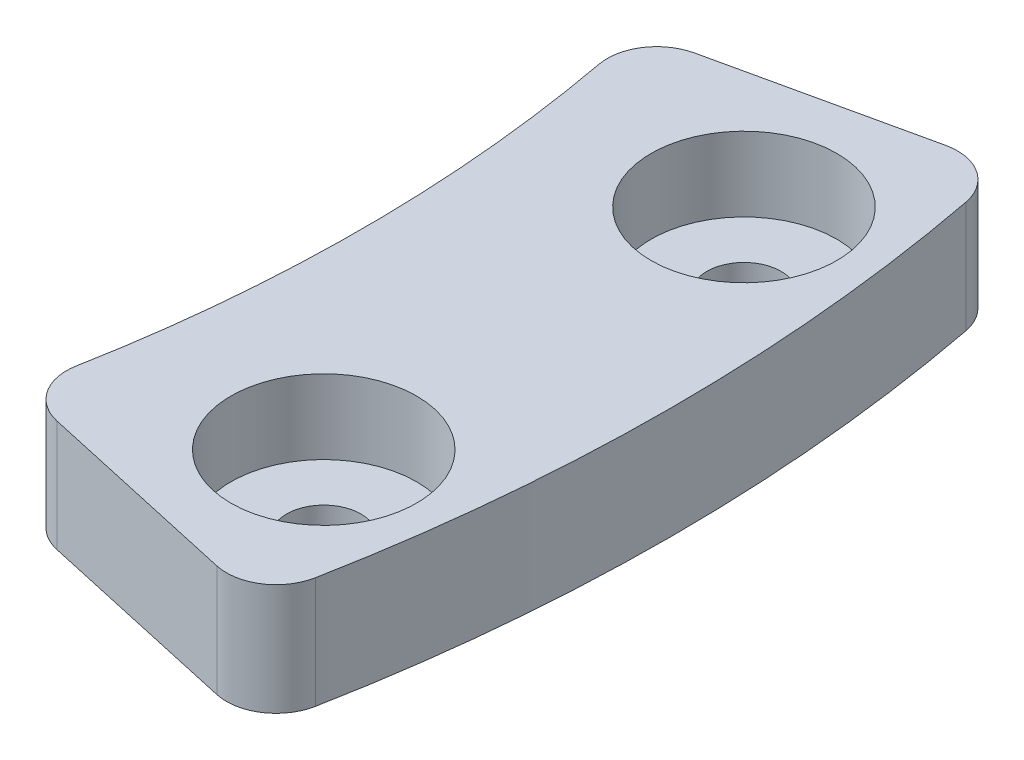
ISO-10303-21;
HEADER;
FILE_DESCRIPTION(('STEP AP214'),'2;1');
FILE_NAME('part.step','',(''),(''),'','','');
FILE_SCHEMA(('AUTOMOTIVE_DESIGN { 1 0 10303 214 1 1 1 1 }'));
ENDSEC;
DATA;
#1=APPLICATION_CONTEXT('core data for automotive mechanical design processes');
#2=APPLICATION_PROTOCOL_DEFINITION('international standard','automotive_design',2000,#1);
#3=PRODUCT_CONTEXT('',#1,'mechanical');
#4=PRODUCT('Part','Part','',(#3));
#5=PRODUCT_RELATED_PRODUCT_CATEGORY('part','',(#4));
#6=PRODUCT_DEFINITION_FORMATION('','',#4);
#7=PRODUCT_DEFINITION_CONTEXT('part definition',#1,'design');
#8=PRODUCT_DEFINITION('design','',#6,#7);
#9=PRODUCT_DEFINITION_SHAPE('','',#8);
#10=(LENGTH_UNIT() NAMED_UNIT(*) SI_UNIT(.MILLI.,.METRE.));
#11=(NAMED_UNIT(*) PLANE_ANGLE_UNIT() SI_UNIT($,.RADIAN.));
#12=(NAMED_UNIT(*) SI_UNIT($,.STERADIAN.) SOLID_ANGLE_UNIT());
#13=UNCERTAINTY_MEASURE_WITH_UNIT(LENGTH_MEASURE(1.E-05),#10,'distance_accuracy_value','');
#14=(GEOMETRIC_REPRESENTATION_CONTEXT(3) GLOBAL_UNCERTAINTY_ASSIGNED_CONTEXT((#13)) GLOBAL_UNIT_ASSIGNED_CONTEXT((#10,
#11,#12)) REPRESENTATION_CONTEXT('',''));
#15=CARTESIAN_POINT('',(0.,0.,0.));
#16=DIRECTION('',(0.,0.,1.));
#17=DIRECTION('',(1.,0.,0.));
#18=AXIS2_PLACEMENT_3D('',#15,#16,#17);
#19=CARTESIAN_POINT('',(64.4439159892977,4.5,-8.48420249430342));
#20=DIRECTION('',(0.,-1.,0.));
#21=DIRECTION('',(0.,0.,-1.));
#22=AXIS2_PLACEMENT_3D('',#19,#20,#21);
#23=CYLINDRICAL_SURFACE('',#22,1.5);
#24=CARTESIAN_POINT('',(64.4439159892977,0.,-8.48420249430342));
#25=DIRECTION('',(0.,1.,0.));
#26=DIRECTION('',(0.,0.,1.));
#27=AXIS2_PLACEMENT_3D('',#24,#25,#26);
#28=CIRCLE('',#27,1.5);
#29=CARTESIAN_POINT('',(64.4439159892977,0.,-6.98420249430342));
#30=VERTEX_POINT('',#29);
#31=EDGE_CURVE('E132',#30,#30,#28,.T.);
#32=ORIENTED_EDGE('',*,*,#31,.F.);
#33=EDGE_LOOP('',(#32));
#34=FACE_BOUND('',#33,.T.);
#35=CARTESIAN_POINT('',(64.4439159892977,1.5,-8.48420249430342));
#36=DIRECTION('',(0.,1.,0.));
#37=DIRECTION('',(0.,0.,1.));
#38=AXIS2_PLACEMENT_3D('',#35,#36,#37);
#39=CIRCLE('',#38,1.5);
#40=CARTESIAN_POINT('',(64.4439159892977,1.5,-6.98420249430342));
#41=VERTEX_POINT('',#40);
#42=EDGE_CURVE('E38',#41,#41,#39,.T.);
#43=ORIENTED_EDGE('',*,*,#42,.T.);
#44=EDGE_LOOP('',(#43));
#45=FACE_BOUND('',#44,.T.);
#46=ADVANCED_FACE('F34',(#34,#45),#23,.F.);
#47=CARTESIAN_POINT('',(64.4439159892977,4.5,8.48420249430342));
#48=DIRECTION('',(0.,-1.,0.));
#49=DIRECTION('',(0.,0.,-1.));
#50=AXIS2_PLACEMENT_3D('',#47,#48,#49);
#51=CYLINDRICAL_SURFACE('',#50,1.5);
#52=CARTESIAN_POINT('',(64.4439159892977,0.,8.48420249430342));
#53=DIRECTION('',(0.,1.,0.));
#54=DIRECTION('',(0.,0.,-1.));
#55=AXIS2_PLACEMENT_3D('',#52,#53,#54);
#56=CIRCLE('',#55,1.5);
#57=CARTESIAN_POINT('',(64.4439159892977,0.,6.98420249430342));
#58=VERTEX_POINT('',#57);
#59=EDGE_CURVE('E138',#58,#58,#56,.T.);
#60=ORIENTED_EDGE('',*,*,#59,.F.);
#61=EDGE_LOOP('',(#60));
#62=FACE_BOUND('',#61,.T.);
#63=CARTESIAN_POINT('',(64.4439159892977,1.5,8.48420249430342));
#64=DIRECTION('',(0.,1.,0.));
#65=DIRECTION('',(0.,0.,1.));
#66=AXIS2_PLACEMENT_3D('',#63,#64,#65);
#67=CIRCLE('',#66,1.5);
#68=CARTESIAN_POINT('',(64.4439159892977,1.5,9.98420249430342));
#69=VERTEX_POINT('',#68);
#70=EDGE_CURVE('E165',#69,#69,#67,.T.);
#71=ORIENTED_EDGE('',*,*,#70,.T.);
#72=EDGE_LOOP('',(#71));
#73=FACE_BOUND('',#72,.T.);
#74=ADVANCED_FACE('F219',(#62,#73),#51,.F.);
#75=CARTESIAN_POINT('',(0.,4.5,0.));
#76=DIRECTION('',(0.,1.,0.));
#77=DIRECTION('',(0.,0.,1.));
#78=AXIS2_PLACEMENT_3D('',#75,#76,#77);
#79=PLANE('',#78);
#80=CARTESIAN_POINT('',(64.4439159892977,4.5,-8.48420249430342));
#81=DIRECTION('',(0.,1.,0.));
#82=DIRECTION('',(0.,0.,1.));
#83=AXIS2_PLACEMENT_3D('',#80,#81,#82);
#84=CIRCLE('',#83,3.75000000000001);
#85=CARTESIAN_POINT('',(64.4439159892977,4.5,-4.73420249430341));
#86=VERTEX_POINT('',#85);
#87=EDGE_CURVE('E172',#86,#86,#84,.T.);
#88=ORIENTED_EDGE('',*,*,#87,.F.);
#89=EDGE_LOOP('',(#88));
#90=FACE_BOUND('',#89,.T.);
#91=CARTESIAN_POINT('',(64.4439159892977,4.5,8.48420249430342));
#92=DIRECTION('',(0.,1.,0.));
#93=DIRECTION('',(0.,0.,1.));
#94=AXIS2_PLACEMENT_3D('',#91,#92,#93);
#95=CIRCLE('',#94,3.75000000000001);
#96=CARTESIAN_POINT('',(64.4439159892977,4.5,12.2342024943034));
#97=VERTEX_POINT('',#96);
#98=EDGE_CURVE('E182',#97,#97,#95,.T.);
#99=ORIENTED_EDGE('',*,*,#98,.F.);
#100=EDGE_LOOP('',(#99));
#101=FACE_BOUND('',#100,.T.);
#102=DIRECTION('',(0.976296007119933,0.,0.216439613938103));
#103=VECTOR('',#102,1.);
#104=CARTESIAN_POINT('',(56.1370204093962,4.5,12.445277801441));
#105=LINE('',#104,#103);
#106=CARTESIAN_POINT('',(58.0567864762956,4.5,12.8708796919956));
#107=VERTEX_POINT('',#106);
#108=CARTESIAN_POINT('',(66.359407683121,4.5,14.7115264994949));
#109=VERTEX_POINT('',#108);
#110=EDGE_CURVE('E141',#107,#109,#105,.T.);
#111=ORIENTED_EDGE('',*,*,#110,.T.);
#112=CARTESIAN_POINT('',(66.7922869109972,4.5,12.758934485255));
#113=DIRECTION('',(0.,1.,0.));
#114=DIRECTION('',(0.,0.,1.));
#115=AXIS2_PLACEMENT_3D('',#112,#113,#114);
#116=CIRCLE('',#115,2.);
#117=CARTESIAN_POINT('',(68.7567659377913,4.5,13.1341972642331));
#118=VERTEX_POINT('',#117);
#119=EDGE_CURVE('E159',#109,#118,#116,.T.);
#120=ORIENTED_EDGE('',*,*,#119,.T.);
#121=CARTESIAN_POINT('',(0.,4.5,0.));
#122=DIRECTION('',(0.,1.,0.));
#123=DIRECTION('',(0.,0.,1.));
#124=AXIS2_PLACEMENT_3D('',#121,#122,#123);
#125=CIRCLE('',#124,70.);
#126=CARTESIAN_POINT('',(68.7567659377913,4.5,-13.1341972642331));
#127=VERTEX_POINT('',#126);
#128=EDGE_CURVE('E123',#118,#127,#125,.T.);
#129=ORIENTED_EDGE('',*,*,#128,.T.);
#130=CARTESIAN_POINT('',(66.7922869109972,4.5,-12.758934485255));
#131=DIRECTION('',(0.,1.,0.));
#132=DIRECTION('',(0.,0.,1.));
#133=AXIS2_PLACEMENT_3D('',#130,#131,#132);
#134=CIRCLE('',#133,2.);
#135=CARTESIAN_POINT('',(66.359407683121,4.5,-14.7115264994949));
#136=VERTEX_POINT('',#135);
#137=EDGE_CURVE('E155',#127,#136,#134,.T.);
#138=ORIENTED_EDGE('',*,*,#137,.T.);
#139=DIRECTION('',(-0.976296007119933,0.,0.216439613938103));
#140=VECTOR('',#139,1.);
#141=CARTESIAN_POINT('',(56.1370204093962,4.5,-12.445277801441));
#142=LINE('',#141,#140);
#143=CARTESIAN_POINT('',(58.0567864762956,4.5,-12.8708796919956));
#144=VERTEX_POINT('',#143);
#145=EDGE_CURVE('E188',#136,#144,#142,.T.);
#146=ORIENTED_EDGE('',*,*,#145,.T.);
#147=CARTESIAN_POINT('',(58.4896657041718,4.5,-10.9182876777557));
#148=DIRECTION('',(0.,1.,0.));
#149=DIRECTION('',(0.,0.,1.));
#150=AXIS2_PLACEMENT_3D('',#147,#148,#149);
#151=CIRCLE('',#150,2.);
#152=CARTESIAN_POINT('',(56.5236265208383,4.5,-10.5512864112765));
#153=VERTEX_POINT('',#152);
#154=EDGE_CURVE('E58',#144,#153,#151,.T.);
#155=ORIENTED_EDGE('',*,*,#154,.T.);
#156=CARTESIAN_POINT('',(0.,4.5,0.));
#157=DIRECTION('',(0.,-1.,0.));
#158=DIRECTION('',(0.,0.,1.));
#159=AXIS2_PLACEMENT_3D('',#156,#157,#158);
#160=CIRCLE('',#159,57.5);
#161=CARTESIAN_POINT('',(56.5236265208383,4.5,10.5512864112765));
#162=VERTEX_POINT('',#161);
#163=EDGE_CURVE('E189',#153,#162,#160,.T.);
#164=ORIENTED_EDGE('',*,*,#163,.T.);
#165=CARTESIAN_POINT('',(58.4896657041718,4.5,10.9182876777557));
#166=DIRECTION('',(0.,1.,0.));
#167=DIRECTION('',(0.,0.,1.));
#168=AXIS2_PLACEMENT_3D('',#165,#166,#167);
#169=CIRCLE('',#168,2.);
#170=EDGE_CURVE('E157',#162,#107,#169,.T.);
#171=ORIENTED_EDGE('',*,*,#170,.T.);
#172=EDGE_LOOP('',(#111,#120,#129,#138,#146,#155,#164,#171));
#173=FACE_BOUND('',#172,.T.);
#174=ADVANCED_FACE('F193',(#90,#101,#173),#79,.T.);
#175=CARTESIAN_POINT('',(0.,0.,0.));
#176=DIRECTION('',(0.,1.,0.));
#177=DIRECTION('',(0.,0.,1.));
#178=AXIS2_PLACEMENT_3D('',#175,#176,#177);
#179=PLANE('',#178);
#180=CARTESIAN_POINT('',(0.,0.,0.));
#181=DIRECTION('',(0.,1.,0.));
#182=DIRECTION('',(0.,0.,1.));
#183=AXIS2_PLACEMENT_3D('',#180,#181,#182);
#184=CIRCLE('',#183,70.);
#185=CARTESIAN_POINT('',(68.7567659377913,0.,13.1341972642331));
#186=VERTEX_POINT('',#185);
#187=CARTESIAN_POINT('',(68.7567659377913,0.,-13.1341972642331));
#188=VERTEX_POINT('',#187);
#189=EDGE_CURVE('E120',#186,#188,#184,.T.);
#190=ORIENTED_EDGE('',*,*,#189,.F.);
#191=CARTESIAN_POINT('',(66.7922869109972,0.,12.758934485255));
#192=DIRECTION('',(0.,1.,0.));
#193=DIRECTION('',(0.,0.,1.));
#194=AXIS2_PLACEMENT_3D('',#191,#192,#193);
#195=CIRCLE('',#194,2.);
#196=CARTESIAN_POINT('',(66.359407683121,0.,14.7115264994949));
#197=VERTEX_POINT('',#196);
#198=EDGE_CURVE('E103',#186,#197,#195,.F.);
#199=ORIENTED_EDGE('',*,*,#198,.T.);
#200=DIRECTION('',(0.976296007119933,0.,0.216439613938103));
#201=VECTOR('',#200,1.);
#202=CARTESIAN_POINT('',(56.1370204093962,0.,12.445277801441));
#203=LINE('',#202,#201);
#204=CARTESIAN_POINT('',(58.0567864762956,0.,12.8708796919956));
#205=VERTEX_POINT('',#204);
#206=EDGE_CURVE('E145',#205,#197,#203,.T.);
#207=ORIENTED_EDGE('',*,*,#206,.F.);
#208=CARTESIAN_POINT('',(58.4896657041718,0.,10.9182876777557));
#209=DIRECTION('',(0.,1.,0.));
#210=DIRECTION('',(0.,0.,1.));
#211=AXIS2_PLACEMENT_3D('',#208,#209,#210);
#212=CIRCLE('',#211,2.);
#213=CARTESIAN_POINT('',(56.5236265208383,0.,10.5512864112765));
#214=VERTEX_POINT('',#213);
#215=EDGE_CURVE('E114',#205,#214,#212,.F.);
#216=ORIENTED_EDGE('',*,*,#215,.T.);
#217=CARTESIAN_POINT('',(0.,0.,0.));
#218=DIRECTION('',(0.,-1.,0.));
#219=DIRECTION('',(0.,0.,1.));
#220=AXIS2_PLACEMENT_3D('',#217,#218,#219);
#221=CIRCLE('',#220,57.5);
#222=CARTESIAN_POINT('',(56.5236265208383,0.,-10.5512864112765));
#223=VERTEX_POINT('',#222);
#224=EDGE_CURVE('E135',#223,#214,#221,.T.);
#225=ORIENTED_EDGE('',*,*,#224,.F.);
#226=CARTESIAN_POINT('',(58.4896657041718,0.,-10.9182876777557));
#227=DIRECTION('',(0.,1.,0.));
#228=DIRECTION('',(0.,0.,1.));
#229=AXIS2_PLACEMENT_3D('',#226,#227,#228);
#230=CIRCLE('',#229,2.);
#231=CARTESIAN_POINT('',(58.0567864762956,0.,-12.8708796919956));
#232=VERTEX_POINT('',#231);
#233=EDGE_CURVE('E124',#223,#232,#230,.F.);
#234=ORIENTED_EDGE('',*,*,#233,.T.);
#235=DIRECTION('',(-0.976296007119933,0.,0.216439613938103));
#236=VECTOR('',#235,1.);
#237=CARTESIAN_POINT('',(56.1370204093962,0.,-12.445277801441));
#238=LINE('',#237,#236);
#239=CARTESIAN_POINT('',(66.359407683121,0.,-14.7115264994949));
#240=VERTEX_POINT('',#239);
#241=EDGE_CURVE('E131',#240,#232,#238,.T.);
#242=ORIENTED_EDGE('',*,*,#241,.F.);
#243=CARTESIAN_POINT('',(66.7922869109972,0.,-12.758934485255));
#244=DIRECTION('',(0.,1.,0.));
#245=DIRECTION('',(0.,0.,1.));
#246=AXIS2_PLACEMENT_3D('',#243,#244,#245);
#247=CIRCLE('',#246,2.);
#248=EDGE_CURVE('E130',#240,#188,#247,.F.);
#249=ORIENTED_EDGE('',*,*,#248,.T.);
#250=EDGE_LOOP('',(#190,#199,#207,#216,#225,#234,#242,#249));
#251=FACE_BOUND('',#250,.T.);
#252=ORIENTED_EDGE('',*,*,#31,.T.);
#253=EDGE_LOOP('',(#252));
#254=FACE_BOUND('',#253,.T.);
#255=ORIENTED_EDGE('',*,*,#59,.T.);
#256=EDGE_LOOP('',(#255));
#257=FACE_BOUND('',#256,.T.);
#258=ADVANCED_FACE('F127',(#251,#254,#257),#179,.F.);
#259=CARTESIAN_POINT('',(0.,4.5,0.));
#260=DIRECTION('',(0.,-1.,0.));
#261=DIRECTION('',(0.,0.,-1.));
#262=AXIS2_PLACEMENT_3D('',#259,#260,#261);
#263=CYLINDRICAL_SURFACE('',#262,70.);
#264=ORIENTED_EDGE('',*,*,#128,.F.);
#265=DIRECTION('',(0.,-1.,0.));
#266=VECTOR('',#265,1.);
#267=CARTESIAN_POINT('',(68.7567659377913,4.5,13.1341972642331));
#268=LINE('',#267,#266);
#269=EDGE_CURVE('E107',#118,#186,#268,.T.);
#270=ORIENTED_EDGE('',*,*,#269,.T.);
#271=ORIENTED_EDGE('',*,*,#189,.T.);
#272=DIRECTION('',(0.,-1.,0.));
#273=VECTOR('',#272,1.);
#274=CARTESIAN_POINT('',(68.7567659377913,4.5,-13.1341972642331));
#275=LINE('',#274,#273);
#276=EDGE_CURVE('E125',#188,#127,#275,.F.);
#277=ORIENTED_EDGE('',*,*,#276,.T.);
#278=EDGE_LOOP('',(#264,#270,#271,#277));
#279=FACE_BOUND('',#278,.T.);
#280=ADVANCED_FACE('F119',(#279),#263,.T.);
#281=CARTESIAN_POINT('',(56.1370204093962,4.5,-12.445277801441));
#282=DIRECTION('',(0.216439613938103,0.,0.976296007119933));
#283=DIRECTION('',(0.976296007119933,0.,-0.216439613938103));
#284=AXIS2_PLACEMENT_3D('',#281,#282,#283);
#285=PLANE('',#284);
#286=ORIENTED_EDGE('',*,*,#145,.F.);
#287=DIRECTION('',(0.,-1.,0.));
#288=VECTOR('',#287,1.);
#289=CARTESIAN_POINT('',(66.359407683121,4.5,-14.7115264994949));
#290=LINE('',#289,#288);
#291=EDGE_CURVE('E11',#136,#240,#290,.T.);
#292=ORIENTED_EDGE('',*,*,#291,.T.);
#293=ORIENTED_EDGE('',*,*,#241,.T.);
#294=DIRECTION('',(0.,-1.,0.));
#295=VECTOR('',#294,1.);
#296=CARTESIAN_POINT('',(58.0567864762956,4.5,-12.8708796919956));
#297=LINE('',#296,#295);
#298=EDGE_CURVE('E43',#232,#144,#297,.F.);
#299=ORIENTED_EDGE('',*,*,#298,.T.);
#300=EDGE_LOOP('',(#286,#292,#293,#299));
#301=FACE_BOUND('',#300,.T.);
#302=ADVANCED_FACE('F206',(#301),#285,.F.);
#303=CARTESIAN_POINT('',(0.,4.5,0.));
#304=DIRECTION('',(0.,-1.,0.));
#305=DIRECTION('',(0.,0.,-1.));
#306=AXIS2_PLACEMENT_3D('',#303,#304,#305);
#307=CYLINDRICAL_SURFACE('',#306,57.5);
#308=ORIENTED_EDGE('',*,*,#224,.T.);
#309=DIRECTION('',(0.,-1.,0.));
#310=VECTOR('',#309,1.);
#311=CARTESIAN_POINT('',(56.5236265208383,4.5,10.5512864112765));
#312=LINE('',#311,#310);
#313=EDGE_CURVE('E51',#214,#162,#312,.F.);
#314=ORIENTED_EDGE('',*,*,#313,.T.);
#315=ORIENTED_EDGE('',*,*,#163,.F.);
#316=DIRECTION('',(0.,-1.,0.));
#317=VECTOR('',#316,1.);
#318=CARTESIAN_POINT('',(56.5236265208383,4.5,-10.5512864112765));
#319=LINE('',#318,#317);
#320=EDGE_CURVE('E161',#153,#223,#319,.T.);
#321=ORIENTED_EDGE('',*,*,#320,.T.);
#322=EDGE_LOOP('',(#308,#314,#315,#321));
#323=FACE_BOUND('',#322,.T.);
#324=ADVANCED_FACE('F200',(#323),#307,.F.);
#325=CARTESIAN_POINT('',(56.1370204093962,4.5,12.445277801441));
#326=DIRECTION('',(0.216439613938103,0.,-0.976296007119933));
#327=DIRECTION('',(-0.976296007119933,0.,-0.216439613938103));
#328=AXIS2_PLACEMENT_3D('',#325,#326,#327);
#329=PLANE('',#328);
#330=ORIENTED_EDGE('',*,*,#206,.T.);
#331=DIRECTION('',(0.,-1.,0.));
#332=VECTOR('',#331,1.);
#333=CARTESIAN_POINT('',(66.359407683121,4.5,14.7115264994949));
#334=LINE('',#333,#332);
#335=EDGE_CURVE('E108',#197,#109,#334,.F.);
#336=ORIENTED_EDGE('',*,*,#335,.T.);
#337=ORIENTED_EDGE('',*,*,#110,.F.);
#338=DIRECTION('',(0.,-1.,0.));
#339=VECTOR('',#338,1.);
#340=CARTESIAN_POINT('',(58.0567864762956,4.5,12.8708796919956));
#341=LINE('',#340,#339);
#342=EDGE_CURVE('E113',#107,#205,#341,.T.);
#343=ORIENTED_EDGE('',*,*,#342,.T.);
#344=EDGE_LOOP('',(#330,#336,#337,#343));
#345=FACE_BOUND('',#344,.T.);
#346=ADVANCED_FACE('F196',(#345),#329,.F.);
#347=CARTESIAN_POINT('',(66.7922869109972,4.5,12.758934485255));
#348=DIRECTION('',(0.,-1.,0.));
#349=DIRECTION('',(0.,0.,-1.));
#350=AXIS2_PLACEMENT_3D('',#347,#348,#349);
#351=CYLINDRICAL_SURFACE('',#350,2.);
#352=ORIENTED_EDGE('',*,*,#119,.F.);
#353=ORIENTED_EDGE('',*,*,#335,.F.);
#354=ORIENTED_EDGE('',*,*,#198,.F.);
#355=ORIENTED_EDGE('',*,*,#269,.F.);
#356=EDGE_LOOP('',(#352,#353,#354,#355));
#357=FACE_BOUND('',#356,.T.);
#358=ADVANCED_FACE('F106',(#357),#351,.T.);
#359=CARTESIAN_POINT('',(58.4896657041718,4.5,10.9182876777557));
#360=DIRECTION('',(0.,-1.,0.));
#361=DIRECTION('',(0.,0.,-1.));
#362=AXIS2_PLACEMENT_3D('',#359,#360,#361);
#363=CYLINDRICAL_SURFACE('',#362,2.);
#364=ORIENTED_EDGE('',*,*,#170,.F.);
#365=ORIENTED_EDGE('',*,*,#313,.F.);
#366=ORIENTED_EDGE('',*,*,#215,.F.);
#367=ORIENTED_EDGE('',*,*,#342,.F.);
#368=EDGE_LOOP('',(#364,#365,#366,#367));
#369=FACE_BOUND('',#368,.T.);
#370=ADVANCED_FACE('F198',(#369),#363,.T.);
#371=CARTESIAN_POINT('',(66.7922869109972,4.5,-12.758934485255));
#372=DIRECTION('',(0.,-1.,0.));
#373=DIRECTION('',(0.,0.,-1.));
#374=AXIS2_PLACEMENT_3D('',#371,#372,#373);
#375=CYLINDRICAL_SURFACE('',#374,2.);
#376=ORIENTED_EDGE('',*,*,#137,.F.);
#377=ORIENTED_EDGE('',*,*,#276,.F.);
#378=ORIENTED_EDGE('',*,*,#248,.F.);
#379=ORIENTED_EDGE('',*,*,#291,.F.);
#380=EDGE_LOOP('',(#376,#377,#378,#379));
#381=FACE_BOUND('',#380,.T.);
#382=ADVANCED_FACE('F210',(#381),#375,.T.);
#383=CARTESIAN_POINT('',(58.4896657041718,4.5,-10.9182876777557));
#384=DIRECTION('',(0.,-1.,0.));
#385=DIRECTION('',(0.,0.,-1.));
#386=AXIS2_PLACEMENT_3D('',#383,#384,#385);
#387=CYLINDRICAL_SURFACE('',#386,2.);
#388=ORIENTED_EDGE('',*,*,#154,.F.);
#389=ORIENTED_EDGE('',*,*,#298,.F.);
#390=ORIENTED_EDGE('',*,*,#233,.F.);
#391=ORIENTED_EDGE('',*,*,#320,.F.);
#392=EDGE_LOOP('',(#388,#389,#390,#391));
#393=FACE_BOUND('',#392,.T.);
#394=ADVANCED_FACE('F36',(#393),#387,.T.);
#395=CARTESIAN_POINT('',(64.4439159892977,1.5,8.48420249430342));
#396=DIRECTION('',(0.,1.,0.));
#397=DIRECTION('',(0.,0.,1.));
#398=AXIS2_PLACEMENT_3D('',#395,#396,#397);
#399=CYLINDRICAL_SURFACE('',#398,3.75000000000001);
#400=CARTESIAN_POINT('',(64.4439159892977,1.5,8.48420249430342));
#401=DIRECTION('',(0.,1.,0.));
#402=DIRECTION('',(0.,0.,1.));
#403=AXIS2_PLACEMENT_3D('',#400,#401,#402);
#404=CIRCLE('',#403,3.75000000000001);
#405=CARTESIAN_POINT('',(64.4439159892977,1.5,12.2342024943034));
#406=VERTEX_POINT('',#405);
#407=EDGE_CURVE('E177',#406,#406,#404,.T.);
#408=ORIENTED_EDGE('',*,*,#407,.F.);
#409=EDGE_LOOP('',(#408));
#410=FACE_BOUND('',#409,.T.);
#411=ORIENTED_EDGE('',*,*,#98,.T.);
#412=EDGE_LOOP('',(#411));
#413=FACE_BOUND('',#412,.T.);
#414=ADVANCED_FACE('F216',(#410,#413),#399,.F.);
#415=CARTESIAN_POINT('',(64.4439159892977,1.5,8.48420249430342));
#416=DIRECTION('',(0.,1.,0.));
#417=DIRECTION('',(0.,0.,1.));
#418=AXIS2_PLACEMENT_3D('',#415,#416,#417);
#419=PLANE('',#418);
#420=ORIENTED_EDGE('',*,*,#70,.F.);
#421=EDGE_LOOP('',(#420));
#422=FACE_BOUND('',#421,.T.);
#423=ORIENTED_EDGE('',*,*,#407,.T.);
#424=EDGE_LOOP('',(#423));
#425=FACE_BOUND('',#424,.T.);
#426=ADVANCED_FACE('F289',(#422,#425),#419,.T.);
#427=CARTESIAN_POINT('',(64.4439159892977,1.5,-8.48420249430342));
#428=DIRECTION('',(0.,1.,0.));
#429=DIRECTION('',(0.,0.,1.));
#430=AXIS2_PLACEMENT_3D('',#427,#428,#429);
#431=CYLINDRICAL_SURFACE('',#430,3.75000000000001);
#432=CARTESIAN_POINT('',(64.4439159892977,1.5,-8.48420249430342));
#433=DIRECTION('',(0.,1.,0.));
#434=DIRECTION('',(0.,0.,1.));
#435=AXIS2_PLACEMENT_3D('',#432,#433,#434);
#436=CIRCLE('',#435,3.75000000000001);
#437=CARTESIAN_POINT('',(64.4439159892977,1.5,-4.73420249430341));
#438=VERTEX_POINT('',#437);
#439=EDGE_CURVE('E167',#438,#438,#436,.T.);
#440=ORIENTED_EDGE('',*,*,#439,.F.);
#441=EDGE_LOOP('',(#440));
#442=FACE_BOUND('',#441,.T.);
#443=ORIENTED_EDGE('',*,*,#87,.T.);
#444=EDGE_LOOP('',(#443));
#445=FACE_BOUND('',#444,.T.);
#446=ADVANCED_FACE('F298',(#442,#445),#431,.F.);
#447=CARTESIAN_POINT('',(64.4439159892977,1.5,-8.48420249430342));
#448=DIRECTION('',(0.,1.,0.));
#449=DIRECTION('',(0.,0.,1.));
#450=AXIS2_PLACEMENT_3D('',#447,#448,#449);
#451=PLANE('',#450);
#452=ORIENTED_EDGE('',*,*,#42,.F.);
#453=EDGE_LOOP('',(#452));
#454=FACE_BOUND('',#453,.T.);
#455=ORIENTED_EDGE('',*,*,#439,.T.);
#456=EDGE_LOOP('',(#455));
#457=FACE_BOUND('',#456,.T.);
#458=ADVANCED_FACE('F308',(#454,#457),#451,.T.);
#459=CLOSED_SHELL('',(#46,#74,#174,#258,#280,#302,#324,#346,#358,#370,#382,#394,#414,#426,#446,#458));
#460=MANIFOLD_SOLID_BREP('B2',#459);
#461=ADVANCED_BREP_SHAPE_REPRESENTATION('',(#18,#460),#14);
#462=SHAPE_DEFINITION_REPRESENTATION(#9,#461);
ENDSEC;
END-ISO-10303-21;
